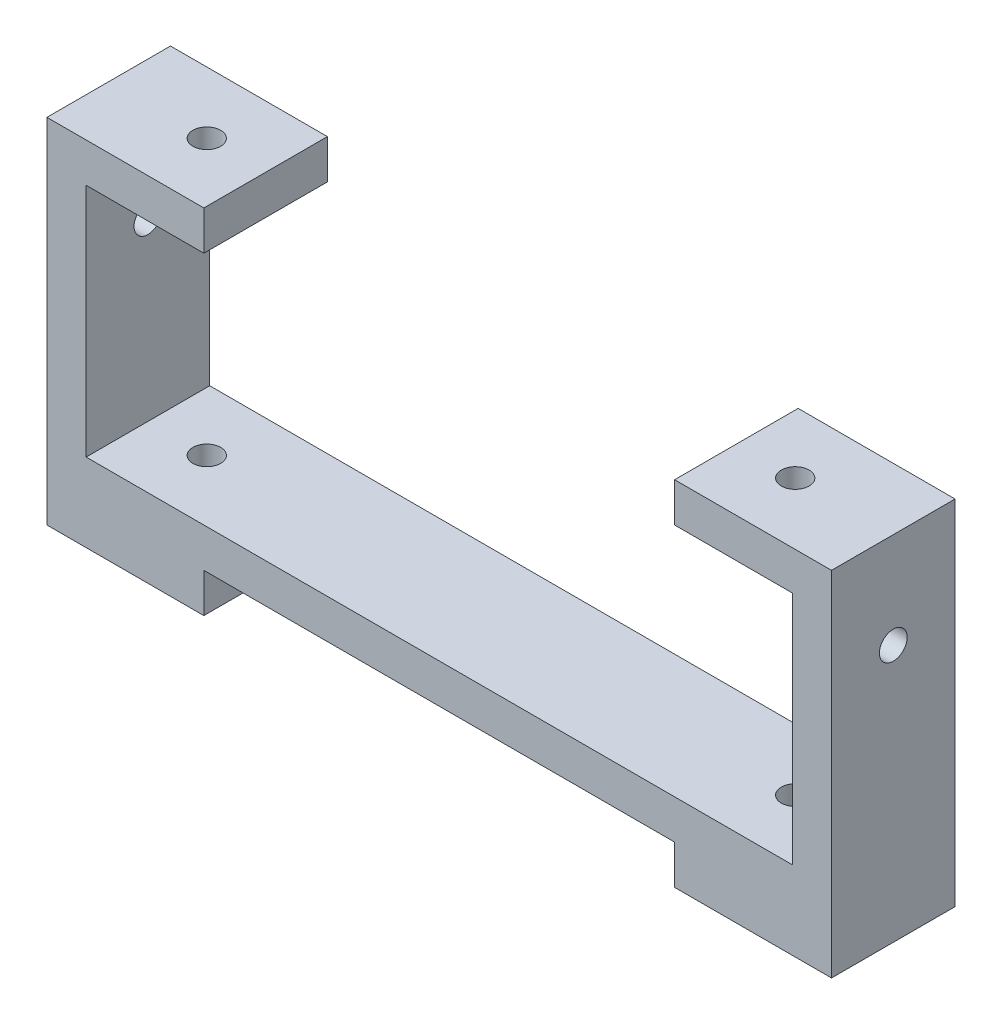
ISO-10303-21;
HEADER;
FILE_DESCRIPTION(('STEP AP214'),'2;1');
FILE_NAME('part.step','',(''),(''),'','','');
FILE_SCHEMA(('AUTOMOTIVE_DESIGN { 1 0 10303 214 1 1 1 1 }'));
ENDSEC;
DATA;
#1=APPLICATION_CONTEXT('core data for automotive mechanical design processes');
#2=APPLICATION_PROTOCOL_DEFINITION('international standard','automotive_design',2000,#1);
#3=PRODUCT_CONTEXT('',#1,'mechanical');
#4=PRODUCT('Part','Part','',(#3));
#5=PRODUCT_RELATED_PRODUCT_CATEGORY('part','',(#4));
#6=PRODUCT_DEFINITION_FORMATION('','',#4);
#7=PRODUCT_DEFINITION_CONTEXT('part definition',#1,'design');
#8=PRODUCT_DEFINITION('design','',#6,#7);
#9=PRODUCT_DEFINITION_SHAPE('','',#8);
#10=(LENGTH_UNIT() NAMED_UNIT(*) SI_UNIT(.MILLI.,.METRE.));
#11=(NAMED_UNIT(*) PLANE_ANGLE_UNIT() SI_UNIT($,.RADIAN.));
#12=(NAMED_UNIT(*) SI_UNIT($,.STERADIAN.) SOLID_ANGLE_UNIT());
#13=UNCERTAINTY_MEASURE_WITH_UNIT(LENGTH_MEASURE(1.E-05),#10,'distance_accuracy_value','');
#14=(GEOMETRIC_REPRESENTATION_CONTEXT(3) GLOBAL_UNCERTAINTY_ASSIGNED_CONTEXT((#13)) GLOBAL_UNIT_ASSIGNED_CONTEXT((#10,
#11,#12)) REPRESENTATION_CONTEXT('',''));
#15=CARTESIAN_POINT('',(0.,0.,0.));
#16=DIRECTION('',(0.,0.,1.));
#17=DIRECTION('',(1.,0.,0.));
#18=AXIS2_PLACEMENT_3D('',#15,#16,#17);
#19=CARTESIAN_POINT('',(57.15,-1.651,10.));
#20=DIRECTION('',(1.,0.,0.));
#21=DIRECTION('',(0.,1.,0.));
#22=AXIS2_PLACEMENT_3D('',#19,#20,#21);
#23=PLANE('',#22);
#24=CARTESIAN_POINT('',(57.15,27.305,0.));
#25=DIRECTION('',(-1.,0.,0.));
#26=DIRECTION('',(0.,0.,1.));
#27=AXIS2_PLACEMENT_3D('',#24,#25,#26);
#28=CIRCLE('',#27,2.25);
#29=CARTESIAN_POINT('',(57.15,27.305,2.25));
#30=VERTEX_POINT('',#29);
#31=EDGE_CURVE('E317',#30,#30,#28,.T.);
#32=ORIENTED_EDGE('',*,*,#31,.F.);
#33=EDGE_LOOP('',(#32));
#34=FACE_BOUND('',#33,.T.);
#35=DIRECTION('',(0.,-1.,0.));
#36=VECTOR('',#35,1.);
#37=CARTESIAN_POINT('',(57.15,-1.651,-10.));
#38=LINE('',#37,#36);
#39=CARTESIAN_POINT('',(57.15,36.449,-10.));
#40=VERTEX_POINT('',#39);
#41=CARTESIAN_POINT('',(57.15,-1.651,-10.));
#42=VERTEX_POINT('',#41);
#43=EDGE_CURVE('E177',#40,#42,#38,.T.);
#44=ORIENTED_EDGE('',*,*,#43,.T.);
#45=DIRECTION('',(0.,0.,-1.));
#46=VECTOR('',#45,1.);
#47=CARTESIAN_POINT('',(57.15,-1.651,10.));
#48=LINE('',#47,#46);
#49=CARTESIAN_POINT('',(57.15,-1.651,10.));
#50=VERTEX_POINT('',#49);
#51=EDGE_CURVE('E11',#50,#42,#48,.T.);
#52=ORIENTED_EDGE('',*,*,#51,.F.);
#53=DIRECTION('',(0.,-1.,0.));
#54=VECTOR('',#53,1.);
#55=CARTESIAN_POINT('',(57.15,-1.651,10.));
#56=LINE('',#55,#54);
#57=CARTESIAN_POINT('',(57.15,36.449,10.));
#58=VERTEX_POINT('',#57);
#59=EDGE_CURVE('E210',#58,#50,#56,.T.);
#60=ORIENTED_EDGE('',*,*,#59,.F.);
#61=DIRECTION('',(0.,0.,-1.));
#62=VECTOR('',#61,1.);
#63=CARTESIAN_POINT('',(57.15,36.449,10.));
#64=LINE('',#63,#62);
#65=EDGE_CURVE('E173',#58,#40,#64,.T.);
#66=ORIENTED_EDGE('',*,*,#65,.T.);
#67=EDGE_LOOP('',(#44,#52,#60,#66));
#68=FACE_BOUND('',#67,.T.);
#69=ADVANCED_FACE('F33',(#34,#68),#23,.F.);
#70=CARTESIAN_POINT('',(-57.15,-1.651,10.));
#71=DIRECTION('',(0.,-1.,0.));
#72=DIRECTION('',(0.,0.,-1.));
#73=AXIS2_PLACEMENT_3D('',#70,#71,#72);
#74=PLANE('',#73);
#75=CARTESIAN_POINT('',(-47.6249999999999,-1.651,0.));
#76=DIRECTION('',(0.,1.,0.));
#77=DIRECTION('',(0.,0.,1.));
#78=AXIS2_PLACEMENT_3D('',#75,#76,#77);
#79=CIRCLE('',#78,2.25);
#80=CARTESIAN_POINT('',(-47.6249999999999,-1.651,2.25));
#81=VERTEX_POINT('',#80);
#82=EDGE_CURVE('E343',#81,#81,#79,.T.);
#83=ORIENTED_EDGE('',*,*,#82,.F.);
#84=EDGE_LOOP('',(#83));
#85=FACE_BOUND('',#84,.T.);
#86=CARTESIAN_POINT('',(47.6249999999999,-1.651,0.));
#87=DIRECTION('',(0.,1.,0.));
#88=DIRECTION('',(0.,0.,-1.));
#89=AXIS2_PLACEMENT_3D('',#86,#87,#88);
#90=CIRCLE('',#89,2.25);
#91=CARTESIAN_POINT('',(47.6249999999999,-1.651,-2.25));
#92=VERTEX_POINT('',#91);
#93=EDGE_CURVE('E342',#92,#92,#90,.T.);
#94=ORIENTED_EDGE('',*,*,#93,.F.);
#95=EDGE_LOOP('',(#94));
#96=FACE_BOUND('',#95,.T.);
#97=DIRECTION('',(-1.,0.,0.));
#98=VECTOR('',#97,1.);
#99=CARTESIAN_POINT('',(-57.15,-1.651,-10.));
#100=LINE('',#99,#98);
#101=CARTESIAN_POINT('',(-57.15,-1.651,-10.));
#102=VERTEX_POINT('',#101);
#103=EDGE_CURVE('E180',#42,#102,#100,.T.);
#104=ORIENTED_EDGE('',*,*,#103,.T.);
#105=DIRECTION('',(0.,0.,-1.));
#106=VECTOR('',#105,1.);
#107=CARTESIAN_POINT('',(-57.15,-1.651,10.));
#108=LINE('',#107,#106);
#109=CARTESIAN_POINT('',(-57.15,-1.651,10.));
#110=VERTEX_POINT('',#109);
#111=EDGE_CURVE('E41',#110,#102,#108,.T.);
#112=ORIENTED_EDGE('',*,*,#111,.F.);
#113=DIRECTION('',(-1.,0.,0.));
#114=VECTOR('',#113,1.);
#115=CARTESIAN_POINT('',(-57.15,-1.651,10.));
#116=LINE('',#115,#114);
#117=EDGE_CURVE('E116',#50,#110,#116,.T.);
#118=ORIENTED_EDGE('',*,*,#117,.F.);
#119=ORIENTED_EDGE('',*,*,#51,.T.);
#120=EDGE_LOOP('',(#104,#112,#118,#119));
#121=FACE_BOUND('',#120,.T.);
#122=ADVANCED_FACE('F309',(#85,#96,#121),#74,.F.);
#123=CARTESIAN_POINT('',(-57.15,-1.651,10.));
#124=DIRECTION('',(-1.,0.,0.));
#125=DIRECTION('',(0.,-1.,0.));
#126=AXIS2_PLACEMENT_3D('',#123,#124,#125);
#127=PLANE('',#126);
#128=CARTESIAN_POINT('',(-57.15,26.797,0.));
#129=DIRECTION('',(1.,0.,0.));
#130=DIRECTION('',(0.,1.,0.));
#131=AXIS2_PLACEMENT_3D('',#128,#129,#130);
#132=CIRCLE('',#131,2.25);
#133=CARTESIAN_POINT('',(-57.15,29.047,0.));
#134=VERTEX_POINT('',#133);
#135=EDGE_CURVE('E332',#134,#134,#132,.T.);
#136=ORIENTED_EDGE('',*,*,#135,.F.);
#137=EDGE_LOOP('',(#136));
#138=FACE_BOUND('',#137,.T.);
#139=DIRECTION('',(0.,1.,0.));
#140=VECTOR('',#139,1.);
#141=CARTESIAN_POINT('',(-57.15,-1.651,-10.));
#142=LINE('',#141,#140);
#143=CARTESIAN_POINT('',(-57.15,36.449,-10.));
#144=VERTEX_POINT('',#143);
#145=EDGE_CURVE('E183',#102,#144,#142,.T.);
#146=ORIENTED_EDGE('',*,*,#145,.T.);
#147=DIRECTION('',(0.,0.,-1.));
#148=VECTOR('',#147,1.);
#149=CARTESIAN_POINT('',(-57.15,36.449,10.));
#150=LINE('',#149,#148);
#151=CARTESIAN_POINT('',(-57.15,36.449,10.));
#152=VERTEX_POINT('',#151);
#153=EDGE_CURVE('E241',#152,#144,#150,.T.);
#154=ORIENTED_EDGE('',*,*,#153,.F.);
#155=DIRECTION('',(0.,1.,0.));
#156=VECTOR('',#155,1.);
#157=CARTESIAN_POINT('',(-57.15,-1.651,10.));
#158=LINE('',#157,#156);
#159=EDGE_CURVE('E249',#110,#152,#158,.T.);
#160=ORIENTED_EDGE('',*,*,#159,.F.);
#161=ORIENTED_EDGE('',*,*,#111,.T.);
#162=EDGE_LOOP('',(#146,#154,#160,#161));
#163=FACE_BOUND('',#162,.T.);
#164=ADVANCED_FACE('F247',(#138,#163),#127,.F.);
#165=CARTESIAN_POINT('',(-57.15,36.449,10.));
#166=DIRECTION('',(0.,1.,0.));
#167=DIRECTION('',(0.,0.,1.));
#168=AXIS2_PLACEMENT_3D('',#165,#166,#167);
#169=PLANE('',#168);
#170=CARTESIAN_POINT('',(-47.625,36.449,0.));
#171=DIRECTION('',(0.,-1.,0.));
#172=DIRECTION('',(0.,0.,-1.));
#173=AXIS2_PLACEMENT_3D('',#170,#171,#172);
#174=CIRCLE('',#173,2.25);
#175=CARTESIAN_POINT('',(-47.625,36.449,-2.25));
#176=VERTEX_POINT('',#175);
#177=EDGE_CURVE('E325',#176,#176,#174,.T.);
#178=ORIENTED_EDGE('',*,*,#177,.F.);
#179=EDGE_LOOP('',(#178));
#180=FACE_BOUND('',#179,.T.);
#181=DIRECTION('',(1.,0.,0.));
#182=VECTOR('',#181,1.);
#183=CARTESIAN_POINT('',(-57.15,36.449,-10.));
#184=LINE('',#183,#182);
#185=CARTESIAN_POINT('',(-38.1,36.449,-10.));
#186=VERTEX_POINT('',#185);
#187=EDGE_CURVE('E185',#144,#186,#184,.T.);
#188=ORIENTED_EDGE('',*,*,#187,.T.);
#189=DIRECTION('',(0.,0.,-1.));
#190=VECTOR('',#189,1.);
#191=CARTESIAN_POINT('',(-38.1,36.449,10.));
#192=LINE('',#191,#190);
#193=CARTESIAN_POINT('',(-38.1,36.449,10.));
#194=VERTEX_POINT('',#193);
#195=EDGE_CURVE('E238',#194,#186,#192,.T.);
#196=ORIENTED_EDGE('',*,*,#195,.F.);
#197=DIRECTION('',(1.,0.,0.));
#198=VECTOR('',#197,1.);
#199=CARTESIAN_POINT('',(-57.15,36.449,10.));
#200=LINE('',#199,#198);
#201=EDGE_CURVE('E267',#152,#194,#200,.T.);
#202=ORIENTED_EDGE('',*,*,#201,.F.);
#203=ORIENTED_EDGE('',*,*,#153,.T.);
#204=EDGE_LOOP('',(#188,#196,#202,#203));
#205=FACE_BOUND('',#204,.T.);
#206=ADVANCED_FACE('F258',(#180,#205),#169,.F.);
#207=CARTESIAN_POINT('',(-38.1,36.449,10.));
#208=DIRECTION('',(-1.,0.,0.));
#209=DIRECTION('',(0.,0.,1.));
#210=AXIS2_PLACEMENT_3D('',#207,#208,#209);
#211=PLANE('',#210);
#212=DIRECTION('',(0.,1.,0.));
#213=VECTOR('',#212,1.);
#214=CARTESIAN_POINT('',(-38.1,36.449,-10.));
#215=LINE('',#214,#213);
#216=CARTESIAN_POINT('',(-38.1,42.799,-10.));
#217=VERTEX_POINT('',#216);
#218=EDGE_CURVE('E187',#186,#217,#215,.T.);
#219=ORIENTED_EDGE('',*,*,#218,.T.);
#220=DIRECTION('',(0.,0.,-1.));
#221=VECTOR('',#220,1.);
#222=CARTESIAN_POINT('',(-38.1,42.799,10.));
#223=LINE('',#222,#221);
#224=CARTESIAN_POINT('',(-38.1,42.799,10.));
#225=VERTEX_POINT('',#224);
#226=EDGE_CURVE('E235',#225,#217,#223,.T.);
#227=ORIENTED_EDGE('',*,*,#226,.F.);
#228=DIRECTION('',(0.,1.,0.));
#229=VECTOR('',#228,1.);
#230=CARTESIAN_POINT('',(-38.1,36.449,10.));
#231=LINE('',#230,#229);
#232=EDGE_CURVE('E264',#194,#225,#231,.T.);
#233=ORIENTED_EDGE('',*,*,#232,.F.);
#234=ORIENTED_EDGE('',*,*,#195,.T.);
#235=EDGE_LOOP('',(#219,#227,#233,#234));
#236=FACE_BOUND('',#235,.T.);
#237=ADVANCED_FACE('F262',(#236),#211,.F.);
#238=CARTESIAN_POINT('',(-38.1,42.799,10.));
#239=DIRECTION('',(0.,-1.,0.));
#240=DIRECTION('',(0.,0.,-1.));
#241=AXIS2_PLACEMENT_3D('',#238,#239,#240);
#242=PLANE('',#241);
#243=CARTESIAN_POINT('',(-47.625,42.799,0.));
#244=DIRECTION('',(0.,-1.,0.));
#245=DIRECTION('',(0.,0.,-1.));
#246=AXIS2_PLACEMENT_3D('',#243,#244,#245);
#247=CIRCLE('',#246,2.25);
#248=CARTESIAN_POINT('',(-47.625,42.799,-2.25));
#249=VERTEX_POINT('',#248);
#250=EDGE_CURVE('E328',#249,#249,#247,.F.);
#251=ORIENTED_EDGE('',*,*,#250,.F.);
#252=EDGE_LOOP('',(#251));
#253=FACE_BOUND('',#252,.T.);
#254=DIRECTION('',(-1.,0.,0.));
#255=VECTOR('',#254,1.);
#256=CARTESIAN_POINT('',(-38.1,42.799,-10.));
#257=LINE('',#256,#255);
#258=CARTESIAN_POINT('',(-63.5,42.799,-10.));
#259=VERTEX_POINT('',#258);
#260=EDGE_CURVE('E189',#217,#259,#257,.T.);
#261=ORIENTED_EDGE('',*,*,#260,.T.);
#262=DIRECTION('',(0.,0.,-1.));
#263=VECTOR('',#262,1.);
#264=CARTESIAN_POINT('',(-63.5,42.799,10.));
#265=LINE('',#264,#263);
#266=CARTESIAN_POINT('',(-63.5,42.799,10.));
#267=VERTEX_POINT('',#266);
#268=EDGE_CURVE('E232',#267,#259,#265,.T.);
#269=ORIENTED_EDGE('',*,*,#268,.F.);
#270=DIRECTION('',(-1.,0.,0.));
#271=VECTOR('',#270,1.);
#272=CARTESIAN_POINT('',(-38.1,42.799,10.));
#273=LINE('',#272,#271);
#274=EDGE_CURVE('E266',#225,#267,#273,.T.);
#275=ORIENTED_EDGE('',*,*,#274,.F.);
#276=ORIENTED_EDGE('',*,*,#226,.T.);
#277=EDGE_LOOP('',(#261,#269,#275,#276));
#278=FACE_BOUND('',#277,.T.);
#279=ADVANCED_FACE('F386',(#253,#278),#242,.F.);
#280=CARTESIAN_POINT('',(-63.5,-14.351,10.));
#281=DIRECTION('',(1.,0.,0.));
#282=DIRECTION('',(0.,1.,0.));
#283=AXIS2_PLACEMENT_3D('',#280,#281,#282);
#284=PLANE('',#283);
#285=CARTESIAN_POINT('',(-63.5,26.797,0.));
#286=DIRECTION('',(1.,0.,0.));
#287=DIRECTION('',(0.,1.,0.));
#288=AXIS2_PLACEMENT_3D('',#285,#286,#287);
#289=CIRCLE('',#288,2.25);
#290=CARTESIAN_POINT('',(-63.5,29.047,0.));
#291=VERTEX_POINT('',#290);
#292=EDGE_CURVE('E339',#291,#291,#289,.F.);
#293=ORIENTED_EDGE('',*,*,#292,.F.);
#294=EDGE_LOOP('',(#293));
#295=FACE_BOUND('',#294,.T.);
#296=DIRECTION('',(0.,-1.,0.));
#297=VECTOR('',#296,1.);
#298=CARTESIAN_POINT('',(-63.5,-14.351,-10.));
#299=LINE('',#298,#297);
#300=CARTESIAN_POINT('',(-63.5,-14.351,-10.));
#301=VERTEX_POINT('',#300);
#302=EDGE_CURVE('E192',#259,#301,#299,.T.);
#303=ORIENTED_EDGE('',*,*,#302,.T.);
#304=DIRECTION('',(0.,0.,-1.));
#305=VECTOR('',#304,1.);
#306=CARTESIAN_POINT('',(-63.5,-14.351,10.));
#307=LINE('',#306,#305);
#308=CARTESIAN_POINT('',(-63.5,-14.351,10.));
#309=VERTEX_POINT('',#308);
#310=EDGE_CURVE('E229',#309,#301,#307,.T.);
#311=ORIENTED_EDGE('',*,*,#310,.F.);
#312=DIRECTION('',(0.,-1.,0.));
#313=VECTOR('',#312,1.);
#314=CARTESIAN_POINT('',(-63.5,42.799,10.));
#315=LINE('',#314,#313);
#316=EDGE_CURVE('E269',#267,#309,#315,.T.);
#317=ORIENTED_EDGE('',*,*,#316,.F.);
#318=ORIENTED_EDGE('',*,*,#268,.T.);
#319=EDGE_LOOP('',(#303,#311,#317,#318));
#320=FACE_BOUND('',#319,.T.);
#321=ADVANCED_FACE('F382',(#295,#320),#284,.F.);
#322=CARTESIAN_POINT('',(-38.1,-14.351,10.));
#323=DIRECTION('',(0.,1.,0.));
#324=DIRECTION('',(-1.,0.,0.));
#325=AXIS2_PLACEMENT_3D('',#322,#323,#324);
#326=PLANE('',#325);
#327=CARTESIAN_POINT('',(-47.6249999999999,-14.351,0.));
#328=DIRECTION('',(0.,1.,0.));
#329=DIRECTION('',(-1.,0.,0.));
#330=AXIS2_PLACEMENT_3D('',#327,#328,#329);
#331=CIRCLE('',#330,2.25);
#332=CARTESIAN_POINT('',(-49.8749999999999,-14.351,0.));
#333=VERTEX_POINT('',#332);
#334=EDGE_CURVE('E181',#333,#333,#331,.F.);
#335=ORIENTED_EDGE('',*,*,#334,.F.);
#336=EDGE_LOOP('',(#335));
#337=FACE_BOUND('',#336,.T.);
#338=DIRECTION('',(1.,0.,0.));
#339=VECTOR('',#338,1.);
#340=CARTESIAN_POINT('',(-38.1,-14.351,-10.));
#341=LINE('',#340,#339);
#342=CARTESIAN_POINT('',(-38.1,-14.351,-10.));
#343=VERTEX_POINT('',#342);
#344=EDGE_CURVE('E194',#301,#343,#341,.T.);
#345=ORIENTED_EDGE('',*,*,#344,.T.);
#346=DIRECTION('',(0.,0.,-1.));
#347=VECTOR('',#346,1.);
#348=CARTESIAN_POINT('',(-38.1,-14.351,10.));
#349=LINE('',#348,#347);
#350=CARTESIAN_POINT('',(-38.1,-14.351,10.));
#351=VERTEX_POINT('',#350);
#352=EDGE_CURVE('E226',#351,#343,#349,.T.);
#353=ORIENTED_EDGE('',*,*,#352,.F.);
#354=DIRECTION('',(1.,0.,0.));
#355=VECTOR('',#354,1.);
#356=CARTESIAN_POINT('',(-38.1,-14.351,10.));
#357=LINE('',#356,#355);
#358=EDGE_CURVE('E275',#309,#351,#357,.T.);
#359=ORIENTED_EDGE('',*,*,#358,.F.);
#360=ORIENTED_EDGE('',*,*,#310,.T.);
#361=EDGE_LOOP('',(#345,#353,#359,#360));
#362=FACE_BOUND('',#361,.T.);
#363=ADVANCED_FACE('F378',(#337,#362),#326,.F.);
#364=CARTESIAN_POINT('',(-38.1,-8.001,10.));
#365=DIRECTION('',(-1.,0.,0.));
#366=DIRECTION('',(0.,0.,1.));
#367=AXIS2_PLACEMENT_3D('',#364,#365,#366);
#368=PLANE('',#367);
#369=DIRECTION('',(0.,1.,0.));
#370=VECTOR('',#369,1.);
#371=CARTESIAN_POINT('',(-38.1,-8.001,-10.));
#372=LINE('',#371,#370);
#373=CARTESIAN_POINT('',(-38.1,-8.001,-10.));
#374=VERTEX_POINT('',#373);
#375=EDGE_CURVE('E196',#343,#374,#372,.T.);
#376=ORIENTED_EDGE('',*,*,#375,.T.);
#377=DIRECTION('',(0.,0.,-1.));
#378=VECTOR('',#377,1.);
#379=CARTESIAN_POINT('',(-38.1,-8.001,10.));
#380=LINE('',#379,#378);
#381=CARTESIAN_POINT('',(-38.1,-8.001,10.));
#382=VERTEX_POINT('',#381);
#383=EDGE_CURVE('E223',#382,#374,#380,.T.);
#384=ORIENTED_EDGE('',*,*,#383,.F.);
#385=DIRECTION('',(0.,1.,0.));
#386=VECTOR('',#385,1.);
#387=CARTESIAN_POINT('',(-38.1,-8.001,10.));
#388=LINE('',#387,#386);
#389=EDGE_CURVE('E277',#351,#382,#388,.T.);
#390=ORIENTED_EDGE('',*,*,#389,.F.);
#391=ORIENTED_EDGE('',*,*,#352,.T.);
#392=EDGE_LOOP('',(#376,#384,#390,#391));
#393=FACE_BOUND('',#392,.T.);
#394=ADVANCED_FACE('F374',(#393),#368,.F.);
#395=CARTESIAN_POINT('',(38.1,-8.001,10.));
#396=DIRECTION('',(0.,1.,0.));
#397=DIRECTION('',(0.,0.,1.));
#398=AXIS2_PLACEMENT_3D('',#395,#396,#397);
#399=PLANE('',#398);
#400=DIRECTION('',(1.,0.,0.));
#401=VECTOR('',#400,1.);
#402=CARTESIAN_POINT('',(38.1,-8.001,-10.));
#403=LINE('',#402,#401);
#404=CARTESIAN_POINT('',(38.1,-8.001,-10.));
#405=VERTEX_POINT('',#404);
#406=EDGE_CURVE('E198',#374,#405,#403,.T.);
#407=ORIENTED_EDGE('',*,*,#406,.T.);
#408=DIRECTION('',(0.,0.,-1.));
#409=VECTOR('',#408,1.);
#410=CARTESIAN_POINT('',(38.1,-8.001,10.));
#411=LINE('',#410,#409);
#412=CARTESIAN_POINT('',(38.1,-8.001,10.));
#413=VERTEX_POINT('',#412);
#414=EDGE_CURVE('E220',#413,#405,#411,.T.);
#415=ORIENTED_EDGE('',*,*,#414,.F.);
#416=DIRECTION('',(1.,0.,0.));
#417=VECTOR('',#416,1.);
#418=CARTESIAN_POINT('',(38.1,-8.001,10.));
#419=LINE('',#418,#417);
#420=EDGE_CURVE('E279',#382,#413,#419,.T.);
#421=ORIENTED_EDGE('',*,*,#420,.F.);
#422=ORIENTED_EDGE('',*,*,#383,.T.);
#423=EDGE_LOOP('',(#407,#415,#421,#422));
#424=FACE_BOUND('',#423,.T.);
#425=ADVANCED_FACE('F367',(#424),#399,.F.);
#426=CARTESIAN_POINT('',(38.1,-8.001,10.));
#427=DIRECTION('',(1.,0.,0.));
#428=DIRECTION('',(0.,0.,-1.));
#429=AXIS2_PLACEMENT_3D('',#426,#427,#428);
#430=PLANE('',#429);
#431=DIRECTION('',(0.,-1.,0.));
#432=VECTOR('',#431,1.);
#433=CARTESIAN_POINT('',(38.1,-8.001,-10.));
#434=LINE('',#433,#432);
#435=CARTESIAN_POINT('',(38.1,-14.351,-10.));
#436=VERTEX_POINT('',#435);
#437=EDGE_CURVE('E200',#405,#436,#434,.T.);
#438=ORIENTED_EDGE('',*,*,#437,.T.);
#439=DIRECTION('',(0.,0.,-1.));
#440=VECTOR('',#439,1.);
#441=CARTESIAN_POINT('',(38.1,-14.351,10.));
#442=LINE('',#441,#440);
#443=CARTESIAN_POINT('',(38.1,-14.351,10.));
#444=VERTEX_POINT('',#443);
#445=EDGE_CURVE('E217',#444,#436,#442,.T.);
#446=ORIENTED_EDGE('',*,*,#445,.F.);
#447=DIRECTION('',(0.,-1.,0.));
#448=VECTOR('',#447,1.);
#449=CARTESIAN_POINT('',(38.1,-8.001,10.));
#450=LINE('',#449,#448);
#451=EDGE_CURVE('E281',#413,#444,#450,.T.);
#452=ORIENTED_EDGE('',*,*,#451,.F.);
#453=ORIENTED_EDGE('',*,*,#414,.T.);
#454=EDGE_LOOP('',(#438,#446,#452,#453));
#455=FACE_BOUND('',#454,.T.);
#456=ADVANCED_FACE('F359',(#455),#430,.F.);
#457=CARTESIAN_POINT('',(38.1,-14.351,10.));
#458=DIRECTION('',(0.,1.,0.));
#459=DIRECTION('',(-1.,0.,0.));
#460=AXIS2_PLACEMENT_3D('',#457,#458,#459);
#461=PLANE('',#460);
#462=CARTESIAN_POINT('',(47.6249999999999,-14.351,0.));
#463=DIRECTION('',(0.,1.,0.));
#464=DIRECTION('',(-1.,0.,0.));
#465=AXIS2_PLACEMENT_3D('',#462,#463,#464);
#466=CIRCLE('',#465,2.25);
#467=CARTESIAN_POINT('',(45.3749999999999,-14.351,0.));
#468=VERTEX_POINT('',#467);
#469=EDGE_CURVE('E346',#468,#468,#466,.F.);
#470=ORIENTED_EDGE('',*,*,#469,.F.);
#471=EDGE_LOOP('',(#470));
#472=FACE_BOUND('',#471,.T.);
#473=DIRECTION('',(1.,0.,0.));
#474=VECTOR('',#473,1.);
#475=CARTESIAN_POINT('',(38.1,-14.351,-10.));
#476=LINE('',#475,#474);
#477=CARTESIAN_POINT('',(63.5,-14.351,-10.));
#478=VERTEX_POINT('',#477);
#479=EDGE_CURVE('E202',#436,#478,#476,.T.);
#480=ORIENTED_EDGE('',*,*,#479,.T.);
#481=DIRECTION('',(0.,0.,-1.));
#482=VECTOR('',#481,1.);
#483=CARTESIAN_POINT('',(63.5,-14.351,10.));
#484=LINE('',#483,#482);
#485=CARTESIAN_POINT('',(63.5,-14.351,10.));
#486=VERTEX_POINT('',#485);
#487=EDGE_CURVE('E214',#486,#478,#484,.T.);
#488=ORIENTED_EDGE('',*,*,#487,.F.);
#489=DIRECTION('',(1.,0.,0.));
#490=VECTOR('',#489,1.);
#491=CARTESIAN_POINT('',(38.1,-14.351,10.));
#492=LINE('',#491,#490);
#493=EDGE_CURVE('E283',#444,#486,#492,.T.);
#494=ORIENTED_EDGE('',*,*,#493,.F.);
#495=ORIENTED_EDGE('',*,*,#445,.T.);
#496=EDGE_LOOP('',(#480,#488,#494,#495));
#497=FACE_BOUND('',#496,.T.);
#498=ADVANCED_FACE('F289',(#472,#497),#461,.F.);
#499=CARTESIAN_POINT('',(63.5,42.799,10.));
#500=DIRECTION('',(-1.,0.,0.));
#501=DIRECTION('',(0.,0.,1.));
#502=AXIS2_PLACEMENT_3D('',#499,#500,#501);
#503=PLANE('',#502);
#504=CARTESIAN_POINT('',(63.5,27.305,0.));
#505=DIRECTION('',(-1.,0.,0.));
#506=DIRECTION('',(0.,0.,1.));
#507=AXIS2_PLACEMENT_3D('',#504,#505,#506);
#508=CIRCLE('',#507,2.25);
#509=CARTESIAN_POINT('',(63.5,27.305,2.25));
#510=VERTEX_POINT('',#509);
#511=EDGE_CURVE('E319',#510,#510,#508,.F.);
#512=ORIENTED_EDGE('',*,*,#511,.F.);
#513=EDGE_LOOP('',(#512));
#514=FACE_BOUND('',#513,.T.);
#515=DIRECTION('',(0.,1.,0.));
#516=VECTOR('',#515,1.);
#517=CARTESIAN_POINT('',(63.5,42.799,-10.));
#518=LINE('',#517,#516);
#519=CARTESIAN_POINT('',(63.5,42.799,-10.));
#520=VERTEX_POINT('',#519);
#521=EDGE_CURVE('E205',#478,#520,#518,.T.);
#522=ORIENTED_EDGE('',*,*,#521,.T.);
#523=DIRECTION('',(0.,0.,-1.));
#524=VECTOR('',#523,1.);
#525=CARTESIAN_POINT('',(63.5,42.799,10.));
#526=LINE('',#525,#524);
#527=CARTESIAN_POINT('',(63.5,42.799,10.));
#528=VERTEX_POINT('',#527);
#529=EDGE_CURVE('E168',#528,#520,#526,.T.);
#530=ORIENTED_EDGE('',*,*,#529,.F.);
#531=DIRECTION('',(0.,1.,0.));
#532=VECTOR('',#531,1.);
#533=CARTESIAN_POINT('',(63.5,-14.351,10.));
#534=LINE('',#533,#532);
#535=EDGE_CURVE('E159',#486,#528,#534,.T.);
#536=ORIENTED_EDGE('',*,*,#535,.F.);
#537=ORIENTED_EDGE('',*,*,#487,.T.);
#538=EDGE_LOOP('',(#522,#530,#536,#537));
#539=FACE_BOUND('',#538,.T.);
#540=ADVANCED_FACE('F292',(#514,#539),#503,.F.);
#541=CARTESIAN_POINT('',(38.1,42.799,10.));
#542=DIRECTION('',(0.,-1.,0.));
#543=DIRECTION('',(0.,0.,-1.));
#544=AXIS2_PLACEMENT_3D('',#541,#542,#543);
#545=PLANE('',#544);
#546=CARTESIAN_POINT('',(47.625,42.799,0.));
#547=DIRECTION('',(0.,-1.,0.));
#548=DIRECTION('',(0.,0.,-1.));
#549=AXIS2_PLACEMENT_3D('',#546,#547,#548);
#550=CIRCLE('',#549,2.25);
#551=CARTESIAN_POINT('',(47.625,42.799,-2.25));
#552=VERTEX_POINT('',#551);
#553=EDGE_CURVE('E329',#552,#552,#550,.F.);
#554=ORIENTED_EDGE('',*,*,#553,.F.);
#555=EDGE_LOOP('',(#554));
#556=FACE_BOUND('',#555,.T.);
#557=DIRECTION('',(-1.,0.,0.));
#558=VECTOR('',#557,1.);
#559=CARTESIAN_POINT('',(38.1,42.799,-10.));
#560=LINE('',#559,#558);
#561=CARTESIAN_POINT('',(38.1,42.799,-10.));
#562=VERTEX_POINT('',#561);
#563=EDGE_CURVE('E167',#520,#562,#560,.T.);
#564=ORIENTED_EDGE('',*,*,#563,.T.);
#565=DIRECTION('',(0.,0.,-1.));
#566=VECTOR('',#565,1.);
#567=CARTESIAN_POINT('',(38.1,42.799,10.));
#568=LINE('',#567,#566);
#569=CARTESIAN_POINT('',(38.1,42.799,10.));
#570=VERTEX_POINT('',#569);
#571=EDGE_CURVE('E164',#570,#562,#568,.T.);
#572=ORIENTED_EDGE('',*,*,#571,.F.);
#573=DIRECTION('',(-1.,0.,0.));
#574=VECTOR('',#573,1.);
#575=CARTESIAN_POINT('',(38.1,42.799,10.));
#576=LINE('',#575,#574);
#577=EDGE_CURVE('E153',#528,#570,#576,.T.);
#578=ORIENTED_EDGE('',*,*,#577,.F.);
#579=ORIENTED_EDGE('',*,*,#529,.T.);
#580=EDGE_LOOP('',(#564,#572,#578,#579));
#581=FACE_BOUND('',#580,.T.);
#582=ADVANCED_FACE('F165',(#556,#581),#545,.F.);
#583=CARTESIAN_POINT('',(38.1,36.449,10.));
#584=DIRECTION('',(1.,0.,0.));
#585=DIRECTION('',(0.,0.,-1.));
#586=AXIS2_PLACEMENT_3D('',#583,#584,#585);
#587=PLANE('',#586);
#588=DIRECTION('',(0.,-1.,0.));
#589=VECTOR('',#588,1.);
#590=CARTESIAN_POINT('',(38.1,36.449,-10.));
#591=LINE('',#590,#589);
#592=CARTESIAN_POINT('',(38.1,36.449,-10.));
#593=VERTEX_POINT('',#592);
#594=EDGE_CURVE('E102',#562,#593,#591,.T.);
#595=ORIENTED_EDGE('',*,*,#594,.T.);
#596=DIRECTION('',(0.,0.,-1.));
#597=VECTOR('',#596,1.);
#598=CARTESIAN_POINT('',(38.1,36.449,10.));
#599=LINE('',#598,#597);
#600=CARTESIAN_POINT('',(38.1,36.449,10.));
#601=VERTEX_POINT('',#600);
#602=EDGE_CURVE('E169',#601,#593,#599,.T.);
#603=ORIENTED_EDGE('',*,*,#602,.F.);
#604=DIRECTION('',(0.,-1.,0.));
#605=VECTOR('',#604,1.);
#606=CARTESIAN_POINT('',(38.1,36.449,10.));
#607=LINE('',#606,#605);
#608=EDGE_CURVE('E157',#570,#601,#607,.T.);
#609=ORIENTED_EDGE('',*,*,#608,.F.);
#610=ORIENTED_EDGE('',*,*,#571,.T.);
#611=EDGE_LOOP('',(#595,#603,#609,#610));
#612=FACE_BOUND('',#611,.T.);
#613=ADVANCED_FACE('F171',(#612),#587,.F.);
#614=CARTESIAN_POINT('',(57.15,36.449,10.));
#615=DIRECTION('',(0.,1.,0.));
#616=DIRECTION('',(0.,0.,1.));
#617=AXIS2_PLACEMENT_3D('',#614,#615,#616);
#618=PLANE('',#617);
#619=CARTESIAN_POINT('',(47.625,36.449,0.));
#620=DIRECTION('',(0.,-1.,0.));
#621=DIRECTION('',(0.,0.,1.));
#622=AXIS2_PLACEMENT_3D('',#619,#620,#621);
#623=CIRCLE('',#622,2.25);
#624=CARTESIAN_POINT('',(47.625,36.449,-2.25));
#625=VERTEX_POINT('',#624);
#626=EDGE_CURVE('E322',#625,#625,#623,.T.);
#627=ORIENTED_EDGE('',*,*,#626,.F.);
#628=EDGE_LOOP('',(#627));
#629=FACE_BOUND('',#628,.T.);
#630=DIRECTION('',(1.,0.,0.));
#631=VECTOR('',#630,1.);
#632=CARTESIAN_POINT('',(57.15,36.449,-10.));
#633=LINE('',#632,#631);
#634=EDGE_CURVE('E108',#593,#40,#633,.T.);
#635=ORIENTED_EDGE('',*,*,#634,.T.);
#636=ORIENTED_EDGE('',*,*,#65,.F.);
#637=DIRECTION('',(1.,0.,0.));
#638=VECTOR('',#637,1.);
#639=CARTESIAN_POINT('',(57.15,36.449,10.));
#640=LINE('',#639,#638);
#641=EDGE_CURVE('E49',#601,#58,#640,.T.);
#642=ORIENTED_EDGE('',*,*,#641,.F.);
#643=ORIENTED_EDGE('',*,*,#602,.T.);
#644=EDGE_LOOP('',(#635,#636,#642,#643));
#645=FACE_BOUND('',#644,.T.);
#646=ADVANCED_FACE('F296',(#629,#645),#618,.F.);
#647=CARTESIAN_POINT('',(0.,0.,10.));
#648=DIRECTION('',(0.,0.,1.));
#649=DIRECTION('',(1.,0.,0.));
#650=AXIS2_PLACEMENT_3D('',#647,#648,#649);
#651=PLANE('',#650);
#652=ORIENTED_EDGE('',*,*,#59,.T.);
#653=ORIENTED_EDGE('',*,*,#117,.T.);
#654=ORIENTED_EDGE('',*,*,#159,.T.);
#655=ORIENTED_EDGE('',*,*,#201,.T.);
#656=ORIENTED_EDGE('',*,*,#232,.T.);
#657=ORIENTED_EDGE('',*,*,#274,.T.);
#658=ORIENTED_EDGE('',*,*,#316,.T.);
#659=ORIENTED_EDGE('',*,*,#358,.T.);
#660=ORIENTED_EDGE('',*,*,#389,.T.);
#661=ORIENTED_EDGE('',*,*,#420,.T.);
#662=ORIENTED_EDGE('',*,*,#451,.T.);
#663=ORIENTED_EDGE('',*,*,#493,.T.);
#664=ORIENTED_EDGE('',*,*,#535,.T.);
#665=ORIENTED_EDGE('',*,*,#577,.T.);
#666=ORIENTED_EDGE('',*,*,#608,.T.);
#667=ORIENTED_EDGE('',*,*,#641,.T.);
#668=EDGE_LOOP('',(#652,#653,#654,#655,#656,#657,#658,#659,#660,#661,#662,#663,#664,#665,#666,#667));
#669=FACE_BOUND('',#668,.T.);
#670=ADVANCED_FACE('F155',(#669),#651,.T.);
#671=CARTESIAN_POINT('',(0.,0.,-10.));
#672=DIRECTION('',(0.,0.,1.));
#673=DIRECTION('',(1.,0.,0.));
#674=AXIS2_PLACEMENT_3D('',#671,#672,#673);
#675=PLANE('',#674);
#676=ORIENTED_EDGE('',*,*,#43,.F.);
#677=ORIENTED_EDGE('',*,*,#634,.F.);
#678=ORIENTED_EDGE('',*,*,#594,.F.);
#679=ORIENTED_EDGE('',*,*,#563,.F.);
#680=ORIENTED_EDGE('',*,*,#521,.F.);
#681=ORIENTED_EDGE('',*,*,#479,.F.);
#682=ORIENTED_EDGE('',*,*,#437,.F.);
#683=ORIENTED_EDGE('',*,*,#406,.F.);
#684=ORIENTED_EDGE('',*,*,#375,.F.);
#685=ORIENTED_EDGE('',*,*,#344,.F.);
#686=ORIENTED_EDGE('',*,*,#302,.F.);
#687=ORIENTED_EDGE('',*,*,#260,.F.);
#688=ORIENTED_EDGE('',*,*,#218,.F.);
#689=ORIENTED_EDGE('',*,*,#187,.F.);
#690=ORIENTED_EDGE('',*,*,#145,.F.);
#691=ORIENTED_EDGE('',*,*,#103,.F.);
#692=EDGE_LOOP('',(#676,#677,#678,#679,#680,#681,#682,#683,#684,#685,#686,#687,#688,#689,#690,#691));
#693=FACE_BOUND('',#692,.T.);
#694=ADVANCED_FACE('F253',(#693),#675,.F.);
#695=CARTESIAN_POINT('',(47.6249999999999,-14.352,0.));
#696=DIRECTION('',(0.,1.,0.));
#697=DIRECTION('',(0.,0.,1.));
#698=AXIS2_PLACEMENT_3D('',#695,#696,#697);
#699=CYLINDRICAL_SURFACE('',#698,2.25);
#700=ORIENTED_EDGE('',*,*,#93,.T.);
#701=EDGE_LOOP('',(#700));
#702=FACE_BOUND('',#701,.T.);
#703=ORIENTED_EDGE('',*,*,#469,.T.);
#704=EDGE_LOOP('',(#703));
#705=FACE_BOUND('',#704,.T.);
#706=ADVANCED_FACE('F356',(#702,#705),#699,.F.);
#707=CARTESIAN_POINT('',(-47.6249999999999,-14.352,0.));
#708=DIRECTION('',(0.,1.,0.));
#709=DIRECTION('',(0.,0.,1.));
#710=AXIS2_PLACEMENT_3D('',#707,#708,#709);
#711=CYLINDRICAL_SURFACE('',#710,2.25);
#712=ORIENTED_EDGE('',*,*,#82,.T.);
#713=EDGE_LOOP('',(#712));
#714=FACE_BOUND('',#713,.T.);
#715=ORIENTED_EDGE('',*,*,#334,.T.);
#716=EDGE_LOOP('',(#715));
#717=FACE_BOUND('',#716,.T.);
#718=ADVANCED_FACE('F406',(#714,#717),#711,.F.);
#719=CARTESIAN_POINT('',(-63.501,26.797,0.));
#720=DIRECTION('',(1.,0.,0.));
#721=DIRECTION('',(0.,1.,0.));
#722=AXIS2_PLACEMENT_3D('',#719,#720,#721);
#723=CYLINDRICAL_SURFACE('',#722,2.25);
#724=ORIENTED_EDGE('',*,*,#135,.T.);
#725=EDGE_LOOP('',(#724));
#726=FACE_BOUND('',#725,.T.);
#727=ORIENTED_EDGE('',*,*,#292,.T.);
#728=EDGE_LOOP('',(#727));
#729=FACE_BOUND('',#728,.T.);
#730=ADVANCED_FACE('F402',(#726,#729),#723,.F.);
#731=CARTESIAN_POINT('',(47.625,42.8,0.));
#732=DIRECTION('',(0.,-1.,0.));
#733=DIRECTION('',(0.,0.,-1.));
#734=AXIS2_PLACEMENT_3D('',#731,#732,#733);
#735=CYLINDRICAL_SURFACE('',#734,2.25);
#736=CARTESIAN_POINT('',(47.625,36.449,-2.25));
#737=CARTESIAN_POINT('',(47.625,36.5151458333333,-2.25));
#738=CARTESIAN_POINT('',(47.625,36.5812916666667,-2.25));
#739=CARTESIAN_POINT('',(47.625,36.7135833333333,-2.25));
#740=CARTESIAN_POINT('',(47.625,36.7797291666667,-2.25));
#741=CARTESIAN_POINT('',(47.625,36.9120208333333,-2.25));
#742=CARTESIAN_POINT('',(47.625,36.9781666666667,-2.25));
#743=CARTESIAN_POINT('',(47.625,37.1104583333333,-2.25));
#744=CARTESIAN_POINT('',(47.625,37.1766041666667,-2.25));
#745=CARTESIAN_POINT('',(47.625,37.3088958333333,-2.25));
#746=CARTESIAN_POINT('',(47.625,37.3750416666667,-2.25));
#747=CARTESIAN_POINT('',(47.625,37.5073333333333,-2.25));
#748=CARTESIAN_POINT('',(47.625,37.5734791666667,-2.25));
#749=CARTESIAN_POINT('',(47.625,37.7057708333333,-2.25));
#750=CARTESIAN_POINT('',(47.625,37.7719166666667,-2.25));
#751=CARTESIAN_POINT('',(47.625,37.9042083333333,-2.25));
#752=CARTESIAN_POINT('',(47.625,37.9703541666667,-2.25));
#753=CARTESIAN_POINT('',(47.625,38.1026458333333,-2.25));
#754=CARTESIAN_POINT('',(47.625,38.1687916666667,-2.25));
#755=CARTESIAN_POINT('',(47.625,38.3010833333333,-2.25));
#756=CARTESIAN_POINT('',(47.625,38.3672291666667,-2.25));
#757=CARTESIAN_POINT('',(47.625,38.4995208333333,-2.25));
#758=CARTESIAN_POINT('',(47.625,38.5656666666667,-2.25));
#759=CARTESIAN_POINT('',(47.625,38.6979583333333,-2.25));
#760=CARTESIAN_POINT('',(47.625,38.7641041666667,-2.25));
#761=CARTESIAN_POINT('',(47.625,38.8963958333333,-2.25));
#762=CARTESIAN_POINT('',(47.625,38.9625416666667,-2.25));
#763=CARTESIAN_POINT('',(47.625,39.0948333333333,-2.25));
#764=CARTESIAN_POINT('',(47.625,39.1609791666667,-2.25));
#765=CARTESIAN_POINT('',(47.625,39.2932708333333,-2.25));
#766=CARTESIAN_POINT('',(47.625,39.3594166666667,-2.25));
#767=CARTESIAN_POINT('',(47.625,39.4917083333333,-2.25));
#768=CARTESIAN_POINT('',(47.625,39.5578541666667,-2.25));
#769=CARTESIAN_POINT('',(47.625,39.6901458333333,-2.25));
#770=CARTESIAN_POINT('',(47.625,39.7562916666667,-2.25));
#771=CARTESIAN_POINT('',(47.625,39.8885833333333,-2.25));
#772=CARTESIAN_POINT('',(47.625,39.9547291666667,-2.25));
#773=CARTESIAN_POINT('',(47.625,40.0870208333333,-2.25));
#774=CARTESIAN_POINT('',(47.625,40.1531666666667,-2.25));
#775=CARTESIAN_POINT('',(47.625,40.2854583333333,-2.25));
#776=CARTESIAN_POINT('',(47.625,40.3516041666667,-2.25));
#777=CARTESIAN_POINT('',(47.625,40.4838958333333,-2.25));
#778=CARTESIAN_POINT('',(47.625,40.5500416666667,-2.25));
#779=CARTESIAN_POINT('',(47.625,40.6823333333333,-2.25));
#780=CARTESIAN_POINT('',(47.625,40.7484791666667,-2.25));
#781=CARTESIAN_POINT('',(47.625,40.8807708333333,-2.25));
#782=CARTESIAN_POINT('',(47.625,40.9469166666667,-2.25));
#783=CARTESIAN_POINT('',(47.625,41.0792083333333,-2.25));
#784=CARTESIAN_POINT('',(47.625,41.1453541666667,-2.25));
#785=CARTESIAN_POINT('',(47.625,41.2776458333333,-2.25));
#786=CARTESIAN_POINT('',(47.625,41.3437916666667,-2.25));
#787=CARTESIAN_POINT('',(47.625,41.4760833333333,-2.25));
#788=CARTESIAN_POINT('',(47.625,41.5422291666667,-2.25));
#789=CARTESIAN_POINT('',(47.625,41.6745208333333,-2.25));
#790=CARTESIAN_POINT('',(47.625,41.7406666666667,-2.25));
#791=CARTESIAN_POINT('',(47.625,41.8729583333333,-2.25));
#792=CARTESIAN_POINT('',(47.625,41.9391041666667,-2.25));
#793=CARTESIAN_POINT('',(47.625,42.0713958333333,-2.25));
#794=CARTESIAN_POINT('',(47.625,42.1375416666667,-2.25));
#795=CARTESIAN_POINT('',(47.625,42.2698333333333,-2.25));
#796=CARTESIAN_POINT('',(47.625,42.3359791666667,-2.25));
#797=CARTESIAN_POINT('',(47.625,42.4682708333333,-2.25));
#798=CARTESIAN_POINT('',(47.625,42.5344166666667,-2.25));
#799=CARTESIAN_POINT('',(47.625,42.6667083333333,-2.25));
#800=CARTESIAN_POINT('',(47.625,42.7328541666667,-2.25));
#801=CARTESIAN_POINT('',(47.625,42.799,-2.25));
#802=B_SPLINE_CURVE_WITH_KNOTS('',3,(#736,#737,#738,#739,#740,#741,#742,#743,#744,#745,#746,
#747,#748,#749,#750,#751,#752,#753,#754,#755,#756,#757,#758,#759,#760,#761,#762,#763,#764,#765,
#766,#767,#768,#769,#770,#771,#772,#773,#774,#775,#776,#777,#778,#779,#780,#781,#782,#783,#784,
#785,#786,#787,#788,#789,#790,#791,#792,#793,#794,#795,#796,#797,#798,#799,#800,#801),
.UNSPECIFIED.,.F.,.F.,(4,2,2,2,2,2,2,2,2,2,2,2,2,2,2,2,2,2,2,2,2,2,2,2,2,2,2,2,2,2,2,2,4),(0.,
0.198437500000002,0.396875000000005,0.5953125,0.793750000000003,0.992187500000005,1.190625,
1.3890625,1.58750000000001,1.7859375,1.984375,2.18281250000001,2.38125,2.5796875,
2.77812500000001,2.9765625,3.175,3.37343750000001,3.571875,3.7703125,3.96875000000001,4.1671875,
4.365625,4.56406250000001,4.7625,4.96093750000001,5.15937500000001,5.3578125,5.55625000000001,
5.75468750000001,5.953125,6.15156250000001,6.35000000000001),.UNSPECIFIED.);
#803=EDGE_CURVE('BSEAM405',#625,#552,#802,.T.);
#804=ORIENTED_EDGE('',*,*,#626,.T.);
#805=ORIENTED_EDGE('',*,*,#553,.T.);
#806=ORIENTED_EDGE('',*,*,#803,.T.);
#807=ORIENTED_EDGE('',*,*,#803,.F.);
#808=EDGE_LOOP('',(#804,#806,#805,#807));
#809=FACE_BOUND('',#808,.T.);
#810=ADVANCED_FACE('F405',(#809),#735,.F.);
#811=CARTESIAN_POINT('',(-47.625,42.8,0.));
#812=DIRECTION('',(0.,-1.,0.));
#813=DIRECTION('',(0.,0.,-1.));
#814=AXIS2_PLACEMENT_3D('',#811,#812,#813);
#815=CYLINDRICAL_SURFACE('',#814,2.25);
#816=CARTESIAN_POINT('',(-47.625,36.449,-2.25));
#817=CARTESIAN_POINT('',(-47.625,36.5151458333333,-2.25));
#818=CARTESIAN_POINT('',(-47.625,36.5812916666667,-2.25));
#819=CARTESIAN_POINT('',(-47.625,36.7135833333333,-2.25));
#820=CARTESIAN_POINT('',(-47.625,36.7797291666667,-2.25));
#821=CARTESIAN_POINT('',(-47.625,36.9120208333333,-2.25));
#822=CARTESIAN_POINT('',(-47.625,36.9781666666667,-2.25));
#823=CARTESIAN_POINT('',(-47.625,37.1104583333333,-2.25));
#824=CARTESIAN_POINT('',(-47.625,37.1766041666667,-2.25));
#825=CARTESIAN_POINT('',(-47.625,37.3088958333333,-2.25));
#826=CARTESIAN_POINT('',(-47.625,37.3750416666667,-2.25));
#827=CARTESIAN_POINT('',(-47.625,37.5073333333333,-2.25));
#828=CARTESIAN_POINT('',(-47.625,37.5734791666667,-2.25));
#829=CARTESIAN_POINT('',(-47.625,37.7057708333333,-2.25));
#830=CARTESIAN_POINT('',(-47.625,37.7719166666667,-2.25));
#831=CARTESIAN_POINT('',(-47.625,37.9042083333333,-2.25));
#832=CARTESIAN_POINT('',(-47.625,37.9703541666667,-2.25));
#833=CARTESIAN_POINT('',(-47.625,38.1026458333333,-2.25));
#834=CARTESIAN_POINT('',(-47.625,38.1687916666667,-2.25));
#835=CARTESIAN_POINT('',(-47.625,38.3010833333333,-2.25));
#836=CARTESIAN_POINT('',(-47.625,38.3672291666667,-2.25));
#837=CARTESIAN_POINT('',(-47.625,38.4995208333333,-2.25));
#838=CARTESIAN_POINT('',(-47.625,38.5656666666667,-2.25));
#839=CARTESIAN_POINT('',(-47.625,38.6979583333333,-2.25));
#840=CARTESIAN_POINT('',(-47.625,38.7641041666667,-2.25));
#841=CARTESIAN_POINT('',(-47.625,38.8963958333333,-2.25));
#842=CARTESIAN_POINT('',(-47.625,38.9625416666667,-2.25));
#843=CARTESIAN_POINT('',(-47.625,39.0948333333333,-2.25));
#844=CARTESIAN_POINT('',(-47.625,39.1609791666667,-2.25));
#845=CARTESIAN_POINT('',(-47.625,39.2932708333333,-2.25));
#846=CARTESIAN_POINT('',(-47.625,39.3594166666667,-2.25));
#847=CARTESIAN_POINT('',(-47.625,39.4917083333333,-2.25));
#848=CARTESIAN_POINT('',(-47.625,39.5578541666667,-2.25));
#849=CARTESIAN_POINT('',(-47.625,39.6901458333333,-2.25));
#850=CARTESIAN_POINT('',(-47.625,39.7562916666667,-2.25));
#851=CARTESIAN_POINT('',(-47.625,39.8885833333333,-2.25));
#852=CARTESIAN_POINT('',(-47.625,39.9547291666667,-2.25));
#853=CARTESIAN_POINT('',(-47.625,40.0870208333333,-2.25));
#854=CARTESIAN_POINT('',(-47.625,40.1531666666667,-2.25));
#855=CARTESIAN_POINT('',(-47.625,40.2854583333333,-2.25));
#856=CARTESIAN_POINT('',(-47.625,40.3516041666667,-2.25));
#857=CARTESIAN_POINT('',(-47.625,40.4838958333333,-2.25));
#858=CARTESIAN_POINT('',(-47.625,40.5500416666667,-2.25));
#859=CARTESIAN_POINT('',(-47.625,40.6823333333333,-2.25));
#860=CARTESIAN_POINT('',(-47.625,40.7484791666667,-2.25));
#861=CARTESIAN_POINT('',(-47.625,40.8807708333333,-2.25));
#862=CARTESIAN_POINT('',(-47.625,40.9469166666667,-2.25));
#863=CARTESIAN_POINT('',(-47.625,41.0792083333333,-2.25));
#864=CARTESIAN_POINT('',(-47.625,41.1453541666667,-2.25));
#865=CARTESIAN_POINT('',(-47.625,41.2776458333333,-2.25));
#866=CARTESIAN_POINT('',(-47.625,41.3437916666667,-2.25));
#867=CARTESIAN_POINT('',(-47.625,41.4760833333333,-2.25));
#868=CARTESIAN_POINT('',(-47.625,41.5422291666667,-2.25));
#869=CARTESIAN_POINT('',(-47.625,41.6745208333333,-2.25));
#870=CARTESIAN_POINT('',(-47.625,41.7406666666667,-2.25));
#871=CARTESIAN_POINT('',(-47.625,41.8729583333333,-2.25));
#872=CARTESIAN_POINT('',(-47.625,41.9391041666667,-2.25));
#873=CARTESIAN_POINT('',(-47.625,42.0713958333333,-2.25));
#874=CARTESIAN_POINT('',(-47.625,42.1375416666667,-2.25));
#875=CARTESIAN_POINT('',(-47.625,42.2698333333333,-2.25));
#876=CARTESIAN_POINT('',(-47.625,42.3359791666667,-2.25));
#877=CARTESIAN_POINT('',(-47.625,42.4682708333333,-2.25));
#878=CARTESIAN_POINT('',(-47.625,42.5344166666667,-2.25));
#879=CARTESIAN_POINT('',(-47.625,42.6667083333333,-2.25));
#880=CARTESIAN_POINT('',(-47.625,42.7328541666667,-2.25));
#881=CARTESIAN_POINT('',(-47.625,42.799,-2.25));
#882=B_SPLINE_CURVE_WITH_KNOTS('',3,(#816,#817,#818,#819,#820,#821,#822,#823,#824,#825,#826,
#827,#828,#829,#830,#831,#832,#833,#834,#835,#836,#837,#838,#839,#840,#841,#842,#843,#844,#845,
#846,#847,#848,#849,#850,#851,#852,#853,#854,#855,#856,#857,#858,#859,#860,#861,#862,#863,#864,
#865,#866,#867,#868,#869,#870,#871,#872,#873,#874,#875,#876,#877,#878,#879,#880,#881),
.UNSPECIFIED.,.F.,.F.,(4,2,2,2,2,2,2,2,2,2,2,2,2,2,2,2,2,2,2,2,2,2,2,2,2,2,2,2,2,2,2,2,4),(0.,
0.198437500000002,0.396875000000005,0.5953125,0.793750000000003,0.992187500000005,1.190625,
1.3890625,1.58750000000001,1.7859375,1.984375,2.18281250000001,2.38125,2.5796875,
2.77812500000001,2.9765625,3.175,3.37343750000001,3.571875,3.7703125,3.96875000000001,4.1671875,
4.365625,4.56406250000001,4.7625,4.96093750000001,5.15937500000001,5.3578125,5.55625000000001,
5.75468750000001,5.953125,6.15156250000001,6.35000000000001),.UNSPECIFIED.);
#883=EDGE_CURVE('BSEAM429',#176,#249,#882,.T.);
#884=ORIENTED_EDGE('',*,*,#177,.T.);
#885=ORIENTED_EDGE('',*,*,#250,.T.);
#886=ORIENTED_EDGE('',*,*,#883,.T.);
#887=ORIENTED_EDGE('',*,*,#883,.F.);
#888=EDGE_LOOP('',(#884,#886,#885,#887));
#889=FACE_BOUND('',#888,.T.);
#890=ADVANCED_FACE('F429',(#889),#815,.F.);
#891=CARTESIAN_POINT('',(63.501,27.305,0.));
#892=DIRECTION('',(-1.,0.,0.));
#893=DIRECTION('',(0.,0.,1.));
#894=AXIS2_PLACEMENT_3D('',#891,#892,#893);
#895=CYLINDRICAL_SURFACE('',#894,2.25);
#896=CARTESIAN_POINT('',(57.15,27.305,2.25));
#897=CARTESIAN_POINT('',(57.2161458333333,27.305,2.25));
#898=CARTESIAN_POINT('',(57.2822916666667,27.305,2.25));
#899=CARTESIAN_POINT('',(57.4145833333333,27.305,2.25));
#900=CARTESIAN_POINT('',(57.4807291666667,27.305,2.25));
#901=CARTESIAN_POINT('',(57.6130208333333,27.305,2.25));
#902=CARTESIAN_POINT('',(57.6791666666667,27.305,2.25));
#903=CARTESIAN_POINT('',(57.8114583333333,27.305,2.25));
#904=CARTESIAN_POINT('',(57.8776041666667,27.305,2.25));
#905=CARTESIAN_POINT('',(58.0098958333333,27.305,2.25));
#906=CARTESIAN_POINT('',(58.0760416666667,27.305,2.25));
#907=CARTESIAN_POINT('',(58.2083333333333,27.305,2.25));
#908=CARTESIAN_POINT('',(58.2744791666667,27.305,2.25));
#909=CARTESIAN_POINT('',(58.4067708333333,27.305,2.25));
#910=CARTESIAN_POINT('',(58.4729166666667,27.305,2.25));
#911=CARTESIAN_POINT('',(58.6052083333333,27.305,2.25));
#912=CARTESIAN_POINT('',(58.6713541666667,27.305,2.25));
#913=CARTESIAN_POINT('',(58.8036458333333,27.305,2.25));
#914=CARTESIAN_POINT('',(58.8697916666667,27.305,2.25));
#915=CARTESIAN_POINT('',(59.0020833333333,27.305,2.25));
#916=CARTESIAN_POINT('',(59.0682291666667,27.305,2.25));
#917=CARTESIAN_POINT('',(59.2005208333333,27.305,2.25));
#918=CARTESIAN_POINT('',(59.2666666666667,27.305,2.25));
#919=CARTESIAN_POINT('',(59.3989583333333,27.305,2.25));
#920=CARTESIAN_POINT('',(59.4651041666667,27.305,2.25));
#921=CARTESIAN_POINT('',(59.5973958333333,27.305,2.25));
#922=CARTESIAN_POINT('',(59.6635416666667,27.305,2.25));
#923=CARTESIAN_POINT('',(59.7958333333333,27.305,2.25));
#924=CARTESIAN_POINT('',(59.8619791666667,27.305,2.25));
#925=CARTESIAN_POINT('',(59.9942708333333,27.305,2.25));
#926=CARTESIAN_POINT('',(60.0604166666667,27.305,2.25));
#927=CARTESIAN_POINT('',(60.1927083333333,27.305,2.25));
#928=CARTESIAN_POINT('',(60.2588541666667,27.305,2.25));
#929=CARTESIAN_POINT('',(60.3911458333333,27.305,2.25));
#930=CARTESIAN_POINT('',(60.4572916666667,27.305,2.25));
#931=CARTESIAN_POINT('',(60.5895833333333,27.305,2.25));
#932=CARTESIAN_POINT('',(60.6557291666667,27.305,2.25));
#933=CARTESIAN_POINT('',(60.7880208333333,27.305,2.25));
#934=CARTESIAN_POINT('',(60.8541666666667,27.305,2.25));
#935=CARTESIAN_POINT('',(60.9864583333333,27.305,2.25));
#936=CARTESIAN_POINT('',(61.0526041666667,27.305,2.25));
#937=CARTESIAN_POINT('',(61.1848958333333,27.305,2.25));
#938=CARTESIAN_POINT('',(61.2510416666667,27.305,2.25));
#939=CARTESIAN_POINT('',(61.3833333333333,27.305,2.25));
#940=CARTESIAN_POINT('',(61.4494791666667,27.305,2.25));
#941=CARTESIAN_POINT('',(61.5817708333333,27.305,2.25));
#942=CARTESIAN_POINT('',(61.6479166666667,27.305,2.25));
#943=CARTESIAN_POINT('',(61.7802083333333,27.305,2.25));
#944=CARTESIAN_POINT('',(61.8463541666667,27.305,2.25));
#945=CARTESIAN_POINT('',(61.9786458333333,27.305,2.25));
#946=CARTESIAN_POINT('',(62.0447916666667,27.305,2.25));
#947=CARTESIAN_POINT('',(62.1770833333333,27.305,2.25));
#948=CARTESIAN_POINT('',(62.2432291666667,27.305,2.25));
#949=CARTESIAN_POINT('',(62.3755208333333,27.305,2.25));
#950=CARTESIAN_POINT('',(62.4416666666667,27.305,2.25));
#951=CARTESIAN_POINT('',(62.5739583333333,27.305,2.25));
#952=CARTESIAN_POINT('',(62.6401041666667,27.305,2.25));
#953=CARTESIAN_POINT('',(62.7723958333333,27.305,2.25));
#954=CARTESIAN_POINT('',(62.8385416666667,27.305,2.25));
#955=CARTESIAN_POINT('',(62.9708333333333,27.305,2.25));
#956=CARTESIAN_POINT('',(63.0369791666667,27.305,2.25));
#957=CARTESIAN_POINT('',(63.1692708333333,27.305,2.25));
#958=CARTESIAN_POINT('',(63.2354166666667,27.305,2.25));
#959=CARTESIAN_POINT('',(63.3677083333333,27.305,2.25));
#960=CARTESIAN_POINT('',(63.4338541666667,27.305,2.25));
#961=CARTESIAN_POINT('',(63.5,27.305,2.25));
#962=B_SPLINE_CURVE_WITH_KNOTS('',3,(#896,#897,#898,#899,#900,#901,#902,#903,#904,#905,#906,
#907,#908,#909,#910,#911,#912,#913,#914,#915,#916,#917,#918,#919,#920,#921,#922,#923,#924,#925,
#926,#927,#928,#929,#930,#931,#932,#933,#934,#935,#936,#937,#938,#939,#940,#941,#942,#943,#944,
#945,#946,#947,#948,#949,#950,#951,#952,#953,#954,#955,#956,#957,#958,#959,#960,#961),
.UNSPECIFIED.,.F.,.F.,(4,2,2,2,2,2,2,2,2,2,2,2,2,2,2,2,2,2,2,2,2,2,2,2,2,2,2,2,2,2,2,2,4),(0.,
0.198437499999995,0.396874999999998,0.5953125,0.793749999999996,0.992187499999998,1.190625,
1.3890625,1.5875,1.7859375,1.984375,2.1828125,2.38125,2.5796875,2.778125,2.9765625,3.175,
3.3734375,3.571875,3.7703125,3.96875000000001,4.1671875,4.365625,4.56406250000001,4.7625,
4.96093750000001,5.15937500000001,5.35781250000001,5.55625000000001,5.7546875,5.95312500000001,
6.15156250000001,6.35000000000002),.UNSPECIFIED.);
#963=EDGE_CURVE('BSEAM511',#30,#510,#962,.T.);
#964=ORIENTED_EDGE('',*,*,#31,.T.);
#965=ORIENTED_EDGE('',*,*,#511,.T.);
#966=ORIENTED_EDGE('',*,*,#963,.T.);
#967=ORIENTED_EDGE('',*,*,#963,.F.);
#968=EDGE_LOOP('',(#964,#966,#965,#967));
#969=FACE_BOUND('',#968,.T.);
#970=ADVANCED_FACE('F511',(#969),#895,.F.);
#971=CLOSED_SHELL('',(#69,#122,#164,#206,#237,#279,#321,#363,#394,#425,#456,#498,#540,#582,#613,
#646,#670,#694,#706,#718,#730,#810,#890,#970));
#972=MANIFOLD_SOLID_BREP('B2',#971);
#973=ADVANCED_BREP_SHAPE_REPRESENTATION('',(#18,#972),#14);
#974=SHAPE_DEFINITION_REPRESENTATION(#9,#973);
ENDSEC;
END-ISO-10303-21;
